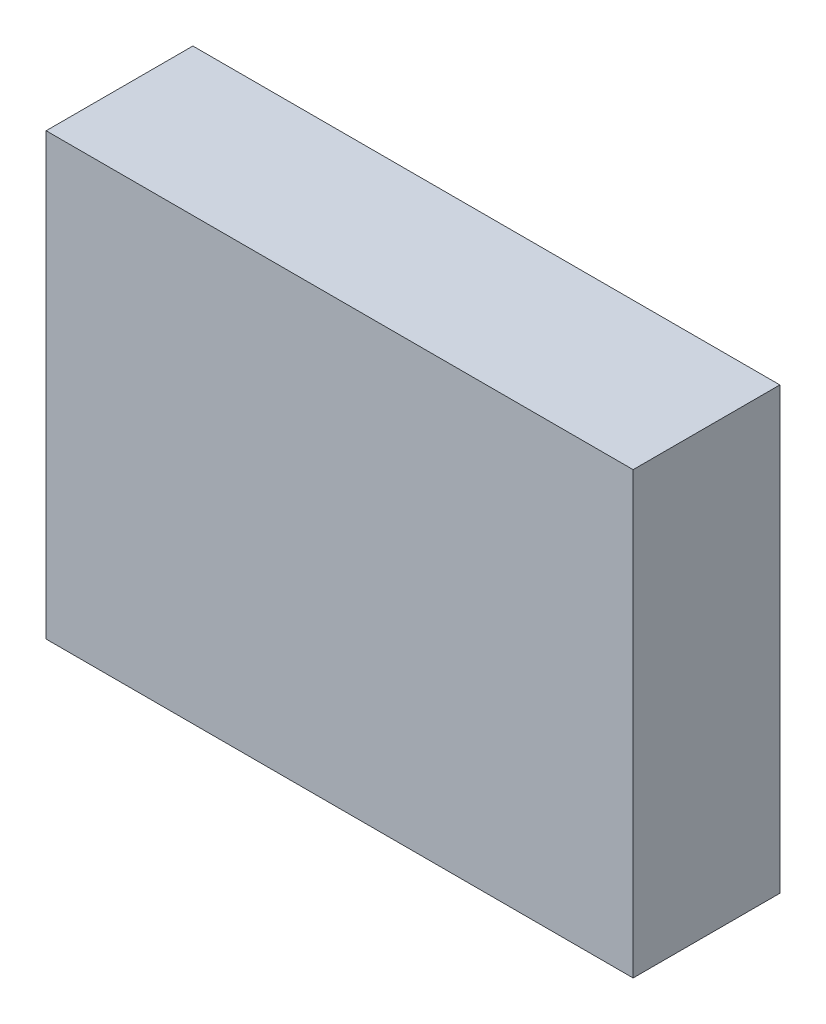
ISO-10303-21;
HEADER;
FILE_DESCRIPTION(('STEP AP214'),'2;1');
FILE_NAME('part.step','',(''),(''),'','','');
FILE_SCHEMA(('AUTOMOTIVE_DESIGN { 1 0 10303 214 1 1 1 1 }'));
ENDSEC;
DATA;
#1=APPLICATION_CONTEXT('core data for automotive mechanical design processes');
#2=APPLICATION_PROTOCOL_DEFINITION('international standard','automotive_design',2000,#1);
#3=PRODUCT_CONTEXT('',#1,'mechanical');
#4=PRODUCT('Part','Part','',(#3));
#5=PRODUCT_RELATED_PRODUCT_CATEGORY('part','',(#4));
#6=PRODUCT_DEFINITION_FORMATION('','',#4);
#7=PRODUCT_DEFINITION_CONTEXT('part definition',#1,'design');
#8=PRODUCT_DEFINITION('design','',#6,#7);
#9=PRODUCT_DEFINITION_SHAPE('','',#8);
#10=(LENGTH_UNIT() NAMED_UNIT(*) SI_UNIT(.MILLI.,.METRE.));
#11=(NAMED_UNIT(*) PLANE_ANGLE_UNIT() SI_UNIT($,.RADIAN.));
#12=(NAMED_UNIT(*) SI_UNIT($,.STERADIAN.) SOLID_ANGLE_UNIT());
#13=UNCERTAINTY_MEASURE_WITH_UNIT(LENGTH_MEASURE(1.E-05),#10,'distance_accuracy_value','');
#14=(GEOMETRIC_REPRESENTATION_CONTEXT(3) GLOBAL_UNCERTAINTY_ASSIGNED_CONTEXT((#13)) GLOBAL_UNIT_ASSIGNED_CONTEXT((#10,
#11,#12)) REPRESENTATION_CONTEXT('',''));
#15=CARTESIAN_POINT('',(0.,0.,0.));
#16=DIRECTION('',(0.,0.,1.));
#17=DIRECTION('',(1.,0.,0.));
#18=AXIS2_PLACEMENT_3D('',#15,#16,#17);
#19=CARTESIAN_POINT('',(0.,0.,3.));
#20=DIRECTION('',(0.,0.,-1.));
#21=DIRECTION('',(-1.,0.,0.));
#22=AXIS2_PLACEMENT_3D('',#19,#20,#21);
#23=CYLINDRICAL_SURFACE('',#22,37.5);
#24=CARTESIAN_POINT('',(0.,0.,3.));
#25=DIRECTION('',(0.,0.,1.));
#26=DIRECTION('',(1.,0.,0.));
#27=AXIS2_PLACEMENT_3D('',#24,#25,#26);
#28=CIRCLE('',#27,37.5);
#29=CARTESIAN_POINT('',(37.5,0.,3.));
#30=VERTEX_POINT('',#29);
#31=EDGE_CURVE('E46',#30,#30,#28,.T.);
#32=ORIENTED_EDGE('',*,*,#31,.F.);
#33=EDGE_LOOP('',(#32));
#34=FACE_BOUND('',#33,.T.);
#35=CARTESIAN_POINT('',(0.,0.,0.));
#36=DIRECTION('',(0.,0.,1.));
#37=DIRECTION('',(1.,0.,0.));
#38=AXIS2_PLACEMENT_3D('',#35,#36,#37);
#39=CIRCLE('',#38,37.5);
#40=CARTESIAN_POINT('',(37.5,0.,0.));
#41=VERTEX_POINT('',#40);
#42=EDGE_CURVE('E148',#41,#41,#39,.T.);
#43=ORIENTED_EDGE('',*,*,#42,.T.);
#44=EDGE_LOOP('',(#43));
#45=FACE_BOUND('',#44,.T.);
#46=ADVANCED_FACE('F38',(#34,#45),#23,.T.);
#47=CARTESIAN_POINT('',(0.,0.,0.));
#48=DIRECTION('',(0.,0.,1.));
#49=DIRECTION('',(1.,0.,0.));
#50=AXIS2_PLACEMENT_3D('',#47,#48,#49);
#51=PLANE('',#50);
#52=CARTESIAN_POINT('',(-30.,1.04744440165294E-13,0.));
#53=DIRECTION('',(0.,0.,1.));
#54=DIRECTION('',(1.,0.,0.));
#55=AXIS2_PLACEMENT_3D('',#52,#53,#54);
#56=CIRCLE('',#55,1.5);
#57=CARTESIAN_POINT('',(-28.5,1.04744440165294E-13,0.));
#58=VERTEX_POINT('',#57);
#59=EDGE_CURVE('E156',#58,#58,#56,.T.);
#60=ORIENTED_EDGE('',*,*,#59,.T.);
#61=EDGE_LOOP('',(#60));
#62=FACE_BOUND('',#61,.T.);
#63=CARTESIAN_POINT('',(-21.2132034355963,21.2132034355965,0.));
#64=DIRECTION('',(0.,0.,1.));
#65=DIRECTION('',(1.,0.,0.));
#66=AXIS2_PLACEMENT_3D('',#63,#64,#65);
#67=CIRCLE('',#66,1.5);
#68=CARTESIAN_POINT('',(-19.7132034355963,21.2132034355965,0.));
#69=VERTEX_POINT('',#68);
#70=EDGE_CURVE('E171',#69,#69,#67,.T.);
#71=ORIENTED_EDGE('',*,*,#70,.T.);
#72=EDGE_LOOP('',(#71));
#73=FACE_BOUND('',#72,.T.);
#74=CARTESIAN_POINT('',(0.,30.,0.));
#75=DIRECTION('',(0.,0.,1.));
#76=DIRECTION('',(1.,0.,0.));
#77=AXIS2_PLACEMENT_3D('',#74,#75,#76);
#78=CIRCLE('',#77,1.5);
#79=CARTESIAN_POINT('',(1.5,30.,0.));
#80=VERTEX_POINT('',#79);
#81=EDGE_CURVE('E168',#80,#80,#78,.T.);
#82=ORIENTED_EDGE('',*,*,#81,.T.);
#83=EDGE_LOOP('',(#82));
#84=FACE_BOUND('',#83,.T.);
#85=CARTESIAN_POINT('',(21.2132034355966,21.2132034355962,0.));
#86=DIRECTION('',(0.,0.,1.));
#87=DIRECTION('',(1.,0.,0.));
#88=AXIS2_PLACEMENT_3D('',#85,#86,#87);
#89=CIRCLE('',#88,1.5);
#90=CARTESIAN_POINT('',(22.7132034355966,21.2132034355962,0.));
#91=VERTEX_POINT('',#90);
#92=EDGE_CURVE('E165',#91,#91,#89,.T.);
#93=ORIENTED_EDGE('',*,*,#92,.T.);
#94=EDGE_LOOP('',(#93));
#95=FACE_BOUND('',#94,.T.);
#96=CARTESIAN_POINT('',(30.,-3.14233320495882E-13,0.));
#97=DIRECTION('',(0.,0.,1.));
#98=DIRECTION('',(1.,0.,0.));
#99=AXIS2_PLACEMENT_3D('',#96,#97,#98);
#100=CIRCLE('',#99,1.5);
#101=CARTESIAN_POINT('',(31.5,-3.14233320495882E-13,0.));
#102=VERTEX_POINT('',#101);
#103=EDGE_CURVE('E162',#102,#102,#100,.T.);
#104=ORIENTED_EDGE('',*,*,#103,.T.);
#105=EDGE_LOOP('',(#104));
#106=FACE_BOUND('',#105,.T.);
#107=CARTESIAN_POINT('',(21.2132034355962,-21.2132034355967,0.));
#108=DIRECTION('',(0.,0.,1.));
#109=DIRECTION('',(1.,0.,0.));
#110=AXIS2_PLACEMENT_3D('',#107,#108,#109);
#111=CIRCLE('',#110,1.5);
#112=CARTESIAN_POINT('',(22.7132034355962,-21.2132034355967,0.));
#113=VERTEX_POINT('',#112);
#114=EDGE_CURVE('E159',#113,#113,#111,.T.);
#115=ORIENTED_EDGE('',*,*,#114,.T.);
#116=EDGE_LOOP('',(#115));
#117=FACE_BOUND('',#116,.T.);
#118=CARTESIAN_POINT('',(-21.2132034355965,-21.2132034355964,0.));
#119=DIRECTION('',(0.,0.,1.));
#120=DIRECTION('',(1.,0.,0.));
#121=AXIS2_PLACEMENT_3D('',#118,#119,#120);
#122=CIRCLE('',#121,1.5);
#123=CARTESIAN_POINT('',(-19.7132034355965,-21.2132034355964,0.));
#124=VERTEX_POINT('',#123);
#125=EDGE_CURVE('E144',#124,#124,#122,.T.);
#126=ORIENTED_EDGE('',*,*,#125,.T.);
#127=EDGE_LOOP('',(#126));
#128=FACE_BOUND('',#127,.T.);
#129=CARTESIAN_POINT('',(0.,-30.,0.));
#130=DIRECTION('',(0.,0.,1.));
#131=DIRECTION('',(1.,0.,0.));
#132=AXIS2_PLACEMENT_3D('',#129,#130,#131);
#133=CIRCLE('',#132,1.5);
#134=CARTESIAN_POINT('',(1.5,-30.,0.));
#135=VERTEX_POINT('',#134);
#136=EDGE_CURVE('E149',#135,#135,#133,.T.);
#137=ORIENTED_EDGE('',*,*,#136,.T.);
#138=EDGE_LOOP('',(#137));
#139=FACE_BOUND('',#138,.T.);
#140=CARTESIAN_POINT('',(0.,0.,0.));
#141=DIRECTION('',(0.,0.,-1.));
#142=DIRECTION('',(-1.,0.,0.));
#143=AXIS2_PLACEMENT_3D('',#140,#141,#142);
#144=CIRCLE('',#143,25.);
#145=CARTESIAN_POINT('',(-25.,0.,0.));
#146=VERTEX_POINT('',#145);
#147=EDGE_CURVE('E145',#146,#146,#144,.T.);
#148=ORIENTED_EDGE('',*,*,#147,.F.);
#149=EDGE_LOOP('',(#148));
#150=FACE_BOUND('',#149,.T.);
#151=ORIENTED_EDGE('',*,*,#42,.F.);
#152=EDGE_LOOP('',(#151));
#153=FACE_BOUND('',#152,.T.);
#154=ADVANCED_FACE('F176',(#62,#73,#84,#95,#106,#117,#128,#139,#150,#153),#51,.F.);
#155=CARTESIAN_POINT('',(0.,-30.,-10.));
#156=DIRECTION('',(0.,0.,1.));
#157=DIRECTION('',(1.,0.,0.));
#158=AXIS2_PLACEMENT_3D('',#155,#156,#157);
#159=CYLINDRICAL_SURFACE('',#158,1.5);
#160=CARTESIAN_POINT('',(0.,-30.,3.));
#161=DIRECTION('',(0.,0.,-1.));
#162=DIRECTION('',(-1.,0.,0.));
#163=AXIS2_PLACEMENT_3D('',#160,#161,#162);
#164=CIRCLE('',#163,1.5);
#165=CARTESIAN_POINT('',(-1.5,-30.,3.));
#166=VERTEX_POINT('',#165);
#167=EDGE_CURVE('E135',#166,#166,#164,.F.);
#168=ORIENTED_EDGE('',*,*,#167,.T.);
#169=EDGE_LOOP('',(#168));
#170=FACE_BOUND('',#169,.T.);
#171=ORIENTED_EDGE('',*,*,#136,.F.);
#172=EDGE_LOOP('',(#171));
#173=FACE_BOUND('',#172,.T.);
#174=ADVANCED_FACE('F201',(#170,#173),#159,.F.);
#175=CARTESIAN_POINT('',(-21.2132034355965,-21.2132034355964,-10.));
#176=DIRECTION('',(0.,0.,1.));
#177=DIRECTION('',(1.,0.,0.));
#178=AXIS2_PLACEMENT_3D('',#175,#176,#177);
#179=CYLINDRICAL_SURFACE('',#178,1.5);
#180=CARTESIAN_POINT('',(-21.2132034355965,-21.2132034355964,3.));
#181=DIRECTION('',(0.,0.,-1.));
#182=DIRECTION('',(-1.,0.,0.));
#183=AXIS2_PLACEMENT_3D('',#180,#181,#182);
#184=CIRCLE('',#183,1.5);
#185=CARTESIAN_POINT('',(-22.7132034355965,-21.2132034355964,3.));
#186=VERTEX_POINT('',#185);
#187=EDGE_CURVE('E132',#186,#186,#184,.F.);
#188=ORIENTED_EDGE('',*,*,#187,.T.);
#189=EDGE_LOOP('',(#188));
#190=FACE_BOUND('',#189,.T.);
#191=ORIENTED_EDGE('',*,*,#125,.F.);
#192=EDGE_LOOP('',(#191));
#193=FACE_BOUND('',#192,.T.);
#194=ADVANCED_FACE('F244',(#190,#193),#179,.F.);
#195=CARTESIAN_POINT('',(21.2132034355962,-21.2132034355967,-10.));
#196=DIRECTION('',(0.,0.,1.));
#197=DIRECTION('',(1.,0.,0.));
#198=AXIS2_PLACEMENT_3D('',#195,#196,#197);
#199=CYLINDRICAL_SURFACE('',#198,1.5);
#200=CARTESIAN_POINT('',(21.2132034355962,-21.2132034355967,3.));
#201=DIRECTION('',(0.,0.,-1.));
#202=DIRECTION('',(-1.,0.,0.));
#203=AXIS2_PLACEMENT_3D('',#200,#201,#202);
#204=CIRCLE('',#203,1.5);
#205=CARTESIAN_POINT('',(19.7132034355962,-21.2132034355967,3.));
#206=VERTEX_POINT('',#205);
#207=EDGE_CURVE('E129',#206,#206,#204,.F.);
#208=ORIENTED_EDGE('',*,*,#207,.T.);
#209=EDGE_LOOP('',(#208));
#210=FACE_BOUND('',#209,.T.);
#211=ORIENTED_EDGE('',*,*,#114,.F.);
#212=EDGE_LOOP('',(#211));
#213=FACE_BOUND('',#212,.T.);
#214=ADVANCED_FACE('F241',(#210,#213),#199,.F.);
#215=CARTESIAN_POINT('',(30.,-3.14233320495882E-13,-10.));
#216=DIRECTION('',(0.,0.,1.));
#217=DIRECTION('',(1.,0.,0.));
#218=AXIS2_PLACEMENT_3D('',#215,#216,#217);
#219=CYLINDRICAL_SURFACE('',#218,1.5);
#220=CARTESIAN_POINT('',(30.,-3.14233320495882E-13,3.));
#221=DIRECTION('',(0.,0.,-1.));
#222=DIRECTION('',(-1.,0.,0.));
#223=AXIS2_PLACEMENT_3D('',#220,#221,#222);
#224=CIRCLE('',#223,1.5);
#225=CARTESIAN_POINT('',(28.5,-3.14233320495882E-13,3.));
#226=VERTEX_POINT('',#225);
#227=EDGE_CURVE('E126',#226,#226,#224,.F.);
#228=ORIENTED_EDGE('',*,*,#227,.T.);
#229=EDGE_LOOP('',(#228));
#230=FACE_BOUND('',#229,.T.);
#231=ORIENTED_EDGE('',*,*,#103,.F.);
#232=EDGE_LOOP('',(#231));
#233=FACE_BOUND('',#232,.T.);
#234=ADVANCED_FACE('F238',(#230,#233),#219,.F.);
#235=CARTESIAN_POINT('',(21.2132034355966,21.2132034355962,-10.));
#236=DIRECTION('',(0.,0.,1.));
#237=DIRECTION('',(1.,0.,0.));
#238=AXIS2_PLACEMENT_3D('',#235,#236,#237);
#239=CYLINDRICAL_SURFACE('',#238,1.5);
#240=CARTESIAN_POINT('',(21.2132034355966,21.2132034355962,3.));
#241=DIRECTION('',(0.,0.,-1.));
#242=DIRECTION('',(-1.,0.,0.));
#243=AXIS2_PLACEMENT_3D('',#240,#241,#242);
#244=CIRCLE('',#243,1.5);
#245=CARTESIAN_POINT('',(19.7132034355966,21.2132034355962,3.));
#246=VERTEX_POINT('',#245);
#247=EDGE_CURVE('E123',#246,#246,#244,.F.);
#248=ORIENTED_EDGE('',*,*,#247,.T.);
#249=EDGE_LOOP('',(#248));
#250=FACE_BOUND('',#249,.T.);
#251=ORIENTED_EDGE('',*,*,#92,.F.);
#252=EDGE_LOOP('',(#251));
#253=FACE_BOUND('',#252,.T.);
#254=ADVANCED_FACE('F240',(#250,#253),#239,.F.);
#255=CARTESIAN_POINT('',(0.,30.,-10.));
#256=DIRECTION('',(0.,0.,1.));
#257=DIRECTION('',(1.,0.,0.));
#258=AXIS2_PLACEMENT_3D('',#255,#256,#257);
#259=CYLINDRICAL_SURFACE('',#258,1.5);
#260=CARTESIAN_POINT('',(0.,30.,3.));
#261=DIRECTION('',(0.,0.,-1.));
#262=DIRECTION('',(-1.,0.,0.));
#263=AXIS2_PLACEMENT_3D('',#260,#261,#262);
#264=CIRCLE('',#263,1.5);
#265=CARTESIAN_POINT('',(-1.5,30.,3.));
#266=VERTEX_POINT('',#265);
#267=EDGE_CURVE('E120',#266,#266,#264,.F.);
#268=ORIENTED_EDGE('',*,*,#267,.T.);
#269=EDGE_LOOP('',(#268));
#270=FACE_BOUND('',#269,.T.);
#271=ORIENTED_EDGE('',*,*,#81,.F.);
#272=EDGE_LOOP('',(#271));
#273=FACE_BOUND('',#272,.T.);
#274=ADVANCED_FACE('F192',(#270,#273),#259,.F.);
#275=CARTESIAN_POINT('',(-21.2132034355963,21.2132034355965,-10.));
#276=DIRECTION('',(0.,0.,1.));
#277=DIRECTION('',(1.,0.,0.));
#278=AXIS2_PLACEMENT_3D('',#275,#276,#277);
#279=CYLINDRICAL_SURFACE('',#278,1.5);
#280=CARTESIAN_POINT('',(-21.2132034355963,21.2132034355965,3.));
#281=DIRECTION('',(0.,0.,-1.));
#282=DIRECTION('',(-1.,0.,0.));
#283=AXIS2_PLACEMENT_3D('',#280,#281,#282);
#284=CIRCLE('',#283,1.5);
#285=CARTESIAN_POINT('',(-22.7132034355963,21.2132034355965,3.));
#286=VERTEX_POINT('',#285);
#287=EDGE_CURVE('E117',#286,#286,#284,.F.);
#288=ORIENTED_EDGE('',*,*,#287,.T.);
#289=EDGE_LOOP('',(#288));
#290=FACE_BOUND('',#289,.T.);
#291=ORIENTED_EDGE('',*,*,#70,.F.);
#292=EDGE_LOOP('',(#291));
#293=FACE_BOUND('',#292,.T.);
#294=ADVANCED_FACE('F182',(#290,#293),#279,.F.);
#295=CARTESIAN_POINT('',(-30.,1.04744440165294E-13,-10.));
#296=DIRECTION('',(0.,0.,1.));
#297=DIRECTION('',(1.,0.,0.));
#298=AXIS2_PLACEMENT_3D('',#295,#296,#297);
#299=CYLINDRICAL_SURFACE('',#298,1.5);
#300=CARTESIAN_POINT('',(-30.,1.04744440165294E-13,3.));
#301=DIRECTION('',(0.,0.,-1.));
#302=DIRECTION('',(-1.,0.,0.));
#303=AXIS2_PLACEMENT_3D('',#300,#301,#302);
#304=CIRCLE('',#303,1.5);
#305=CARTESIAN_POINT('',(-31.5,1.04744440165294E-13,3.));
#306=VERTEX_POINT('',#305);
#307=EDGE_CURVE('E114',#306,#306,#304,.F.);
#308=ORIENTED_EDGE('',*,*,#307,.T.);
#309=EDGE_LOOP('',(#308));
#310=FACE_BOUND('',#309,.T.);
#311=ORIENTED_EDGE('',*,*,#59,.F.);
#312=EDGE_LOOP('',(#311));
#313=FACE_BOUND('',#312,.T.);
#314=ADVANCED_FACE('F179',(#310,#313),#299,.F.);
#315=CARTESIAN_POINT('',(0.,0.,8.));
#316=DIRECTION('',(0.,0.,-1.));
#317=DIRECTION('',(-1.,0.,0.));
#318=AXIS2_PLACEMENT_3D('',#315,#316,#317);
#319=CYLINDRICAL_SURFACE('',#318,25.);
#320=CARTESIAN_POINT('',(0.,0.,-7.));
#321=DIRECTION('',(0.,0.,1.));
#322=DIRECTION('',(1.,0.,0.));
#323=AXIS2_PLACEMENT_3D('',#320,#321,#322);
#324=CIRCLE('',#323,25.);
#325=CARTESIAN_POINT('',(25.,0.,-7.));
#326=VERTEX_POINT('',#325);
#327=EDGE_CURVE('E141',#326,#326,#324,.T.);
#328=ORIENTED_EDGE('',*,*,#327,.T.);
#329=EDGE_LOOP('',(#328));
#330=FACE_BOUND('',#329,.T.);
#331=ORIENTED_EDGE('',*,*,#147,.T.);
#332=EDGE_LOOP('',(#331));
#333=FACE_BOUND('',#332,.T.);
#334=ADVANCED_FACE('F181',(#330,#333),#319,.T.);
#335=CARTESIAN_POINT('',(0.,0.,8.));
#336=DIRECTION('',(0.,0.,-1.));
#337=DIRECTION('',(-1.,0.,0.));
#338=AXIS2_PLACEMENT_3D('',#335,#336,#337);
#339=CYLINDRICAL_SURFACE('',#338,20.);
#340=CARTESIAN_POINT('',(0.,0.,3.));
#341=DIRECTION('',(0.,0.,-1.));
#342=DIRECTION('',(-1.,0.,0.));
#343=AXIS2_PLACEMENT_3D('',#340,#341,#342);
#344=CIRCLE('',#343,20.);
#345=CARTESIAN_POINT('',(-20.,0.,3.));
#346=VERTEX_POINT('',#345);
#347=EDGE_CURVE('E11',#346,#346,#344,.T.);
#348=ORIENTED_EDGE('',*,*,#347,.F.);
#349=EDGE_LOOP('',(#348));
#350=FACE_BOUND('',#349,.T.);
#351=CARTESIAN_POINT('',(0.,0.,-7.));
#352=DIRECTION('',(0.,0.,1.));
#353=DIRECTION('',(1.,0.,0.));
#354=AXIS2_PLACEMENT_3D('',#351,#352,#353);
#355=CIRCLE('',#354,20.);
#356=CARTESIAN_POINT('',(20.,0.,-7.));
#357=VERTEX_POINT('',#356);
#358=EDGE_CURVE('E138',#357,#357,#355,.T.);
#359=ORIENTED_EDGE('',*,*,#358,.F.);
#360=EDGE_LOOP('',(#359));
#361=FACE_BOUND('',#360,.T.);
#362=ADVANCED_FACE('F189',(#350,#361),#339,.F.);
#363=CARTESIAN_POINT('',(0.,0.,-7.));
#364=DIRECTION('',(0.,0.,1.));
#365=DIRECTION('',(1.,0.,0.));
#366=AXIS2_PLACEMENT_3D('',#363,#364,#365);
#367=PLANE('',#366);
#368=ORIENTED_EDGE('',*,*,#358,.T.);
#369=EDGE_LOOP('',(#368));
#370=FACE_BOUND('',#369,.T.);
#371=ORIENTED_EDGE('',*,*,#327,.F.);
#372=EDGE_LOOP('',(#371));
#373=FACE_BOUND('',#372,.T.);
#374=ADVANCED_FACE('F230',(#370,#373),#367,.F.);
#375=CARTESIAN_POINT('',(0.,0.,3.));
#376=DIRECTION('',(0.,0.,-1.));
#377=DIRECTION('',(-1.,0.,0.));
#378=AXIS2_PLACEMENT_3D('',#375,#376,#377);
#379=PLANE('',#378);
#380=ORIENTED_EDGE('',*,*,#347,.T.);
#381=EDGE_LOOP('',(#380));
#382=FACE_BOUND('',#381,.T.);
#383=ADVANCED_FACE('F233',(#382),#379,.T.);
#384=ORIENTED_EDGE('',*,*,#307,.F.);
#385=EDGE_LOOP('',(#384));
#386=FACE_BOUND('',#385,.T.);
#387=ADVANCED_FACE('F213',(#386),#379,.T.);
#388=ORIENTED_EDGE('',*,*,#287,.F.);
#389=EDGE_LOOP('',(#388));
#390=FACE_BOUND('',#389,.T.);
#391=ADVANCED_FACE('F290',(#390),#379,.T.);
#392=ORIENTED_EDGE('',*,*,#267,.F.);
#393=EDGE_LOOP('',(#392));
#394=FACE_BOUND('',#393,.T.);
#395=ADVANCED_FACE('F287',(#394),#379,.T.);
#396=ORIENTED_EDGE('',*,*,#247,.F.);
#397=EDGE_LOOP('',(#396));
#398=FACE_BOUND('',#397,.T.);
#399=ADVANCED_FACE('F289',(#398),#379,.T.);
#400=ORIENTED_EDGE('',*,*,#227,.F.);
#401=EDGE_LOOP('',(#400));
#402=FACE_BOUND('',#401,.T.);
#403=ADVANCED_FACE('F295',(#402),#379,.T.);
#404=ORIENTED_EDGE('',*,*,#207,.F.);
#405=EDGE_LOOP('',(#404));
#406=FACE_BOUND('',#405,.T.);
#407=ADVANCED_FACE('F346',(#406),#379,.T.);
#408=ORIENTED_EDGE('',*,*,#187,.F.);
#409=EDGE_LOOP('',(#408));
#410=FACE_BOUND('',#409,.T.);
#411=ADVANCED_FACE('F356',(#410),#379,.T.);
#412=ORIENTED_EDGE('',*,*,#167,.F.);
#413=EDGE_LOOP('',(#412));
#414=FACE_BOUND('',#413,.T.);
#415=ADVANCED_FACE('F211',(#414),#379,.T.);
#416=ORIENTED_EDGE('',*,*,#31,.T.);
#417=EDGE_LOOP('',(#416));
#418=FACE_BOUND('',#417,.T.);
#419=DIRECTION('',(0.,-1.,0.));
#420=VECTOR('',#419,1.);
#421=CARTESIAN_POINT('',(-100.,75.,3.));
#422=LINE('',#421,#420);
#423=CARTESIAN_POINT('',(-100.,75.,3.));
#424=VERTEX_POINT('',#423);
#425=CARTESIAN_POINT('',(-100.,-75.,3.));
#426=VERTEX_POINT('',#425);
#427=EDGE_CURVE('E105',#424,#426,#422,.T.);
#428=ORIENTED_EDGE('',*,*,#427,.F.);
#429=DIRECTION('',(-1.,0.,0.));
#430=VECTOR('',#429,1.);
#431=CARTESIAN_POINT('',(100.,75.,3.));
#432=LINE('',#431,#430);
#433=CARTESIAN_POINT('',(100.,75.,3.));
#434=VERTEX_POINT('',#433);
#435=EDGE_CURVE('E77',#434,#424,#432,.T.);
#436=ORIENTED_EDGE('',*,*,#435,.F.);
#437=DIRECTION('',(0.,1.,0.));
#438=VECTOR('',#437,1.);
#439=CARTESIAN_POINT('',(100.,75.,3.));
#440=LINE('',#439,#438);
#441=CARTESIAN_POINT('',(100.,-75.,3.));
#442=VERTEX_POINT('',#441);
#443=EDGE_CURVE('E71',#442,#434,#440,.T.);
#444=ORIENTED_EDGE('',*,*,#443,.F.);
#445=DIRECTION('',(1.,0.,0.));
#446=VECTOR('',#445,1.);
#447=CARTESIAN_POINT('',(100.,-75.,3.));
#448=LINE('',#447,#446);
#449=EDGE_CURVE('E95',#426,#442,#448,.T.);
#450=ORIENTED_EDGE('',*,*,#449,.F.);
#451=EDGE_LOOP('',(#428,#436,#444,#450));
#452=FACE_BOUND('',#451,.T.);
#453=ADVANCED_FACE('F207',(#418,#452),#379,.T.);
#454=CARTESIAN_POINT('',(-100.,75.,53.));
#455=DIRECTION('',(1.,0.,0.));
#456=DIRECTION('',(0.,1.,0.));
#457=AXIS2_PLACEMENT_3D('',#454,#455,#456);
#458=PLANE('',#457);
#459=ORIENTED_EDGE('',*,*,#427,.T.);
#460=DIRECTION('',(0.,0.,-1.));
#461=VECTOR('',#460,1.);
#462=CARTESIAN_POINT('',(-100.,-75.,53.));
#463=LINE('',#462,#461);
#464=CARTESIAN_POINT('',(-100.,-75.,53.));
#465=VERTEX_POINT('',#464);
#466=EDGE_CURVE('E96',#465,#426,#463,.T.);
#467=ORIENTED_EDGE('',*,*,#466,.F.);
#468=DIRECTION('',(0.,-1.,0.));
#469=VECTOR('',#468,1.);
#470=CARTESIAN_POINT('',(-100.,75.,53.));
#471=LINE('',#470,#469);
#472=CARTESIAN_POINT('',(-100.,75.,53.));
#473=VERTEX_POINT('',#472);
#474=EDGE_CURVE('E90',#473,#465,#471,.T.);
#475=ORIENTED_EDGE('',*,*,#474,.F.);
#476=DIRECTION('',(0.,0.,-1.));
#477=VECTOR('',#476,1.);
#478=CARTESIAN_POINT('',(-100.,75.,53.));
#479=LINE('',#478,#477);
#480=EDGE_CURVE('E101',#473,#424,#479,.T.);
#481=ORIENTED_EDGE('',*,*,#480,.T.);
#482=EDGE_LOOP('',(#459,#467,#475,#481));
#483=FACE_BOUND('',#482,.T.);
#484=ADVANCED_FACE('F210',(#483),#458,.F.);
#485=CARTESIAN_POINT('',(100.,-75.,53.));
#486=DIRECTION('',(0.,1.,0.));
#487=DIRECTION('',(-1.,0.,0.));
#488=AXIS2_PLACEMENT_3D('',#485,#486,#487);
#489=PLANE('',#488);
#490=ORIENTED_EDGE('',*,*,#449,.T.);
#491=DIRECTION('',(0.,0.,-1.));
#492=VECTOR('',#491,1.);
#493=CARTESIAN_POINT('',(100.,-75.,53.));
#494=LINE('',#493,#492);
#495=CARTESIAN_POINT('',(100.,-75.,53.));
#496=VERTEX_POINT('',#495);
#497=EDGE_CURVE('E93',#496,#442,#494,.T.);
#498=ORIENTED_EDGE('',*,*,#497,.F.);
#499=DIRECTION('',(1.,0.,0.));
#500=VECTOR('',#499,1.);
#501=CARTESIAN_POINT('',(100.,-75.,53.));
#502=LINE('',#501,#500);
#503=EDGE_CURVE('E85',#465,#496,#502,.T.);
#504=ORIENTED_EDGE('',*,*,#503,.F.);
#505=ORIENTED_EDGE('',*,*,#466,.T.);
#506=EDGE_LOOP('',(#490,#498,#504,#505));
#507=FACE_BOUND('',#506,.T.);
#508=ADVANCED_FACE('F94',(#507),#489,.F.);
#509=CARTESIAN_POINT('',(100.,75.,53.));
#510=DIRECTION('',(-1.,0.,0.));
#511=DIRECTION('',(0.,-1.,0.));
#512=AXIS2_PLACEMENT_3D('',#509,#510,#511);
#513=PLANE('',#512);
#514=ORIENTED_EDGE('',*,*,#443,.T.);
#515=DIRECTION('',(0.,0.,-1.));
#516=VECTOR('',#515,1.);
#517=CARTESIAN_POINT('',(100.,75.,53.));
#518=LINE('',#517,#516);
#519=CARTESIAN_POINT('',(100.,75.,53.));
#520=VERTEX_POINT('',#519);
#521=EDGE_CURVE('E97',#520,#434,#518,.T.);
#522=ORIENTED_EDGE('',*,*,#521,.F.);
#523=DIRECTION('',(0.,1.,0.));
#524=VECTOR('',#523,1.);
#525=CARTESIAN_POINT('',(100.,75.,53.));
#526=LINE('',#525,#524);
#527=EDGE_CURVE('E88',#496,#520,#526,.T.);
#528=ORIENTED_EDGE('',*,*,#527,.F.);
#529=ORIENTED_EDGE('',*,*,#497,.T.);
#530=EDGE_LOOP('',(#514,#522,#528,#529));
#531=FACE_BOUND('',#530,.T.);
#532=ADVANCED_FACE('F99',(#531),#513,.F.);
#533=CARTESIAN_POINT('',(100.,75.,53.));
#534=DIRECTION('',(0.,-1.,0.));
#535=DIRECTION('',(1.,0.,0.));
#536=AXIS2_PLACEMENT_3D('',#533,#534,#535);
#537=PLANE('',#536);
#538=ORIENTED_EDGE('',*,*,#435,.T.);
#539=ORIENTED_EDGE('',*,*,#480,.F.);
#540=DIRECTION('',(-1.,0.,0.));
#541=VECTOR('',#540,1.);
#542=CARTESIAN_POINT('',(100.,75.,53.));
#543=LINE('',#542,#541);
#544=EDGE_CURVE('E54',#520,#473,#543,.T.);
#545=ORIENTED_EDGE('',*,*,#544,.F.);
#546=ORIENTED_EDGE('',*,*,#521,.T.);
#547=EDGE_LOOP('',(#538,#539,#545,#546));
#548=FACE_BOUND('',#547,.T.);
#549=ADVANCED_FACE('F216',(#548),#537,.F.);
#550=CARTESIAN_POINT('',(0.,0.,53.));
#551=DIRECTION('',(0.,0.,-1.));
#552=DIRECTION('',(-1.,0.,0.));
#553=AXIS2_PLACEMENT_3D('',#550,#551,#552);
#554=PLANE('',#553);
#555=ORIENTED_EDGE('',*,*,#474,.T.);
#556=ORIENTED_EDGE('',*,*,#503,.T.);
#557=ORIENTED_EDGE('',*,*,#527,.T.);
#558=ORIENTED_EDGE('',*,*,#544,.T.);
#559=EDGE_LOOP('',(#555,#556,#557,#558));
#560=FACE_BOUND('',#559,.T.);
#561=ADVANCED_FACE('F86',(#560),#554,.F.);
#562=CLOSED_SHELL('',(#46,#154,#174,#194,#214,#234,#254,#274,#294,#314,#334,#362,#374,#383,#387,
#391,#395,#399,#403,#407,#411,#415,#453,#484,#508,#532,#549,#561));
#563=MANIFOLD_SOLID_BREP('B2',#562);
#564=ADVANCED_BREP_SHAPE_REPRESENTATION('',(#18,#563),#14);
#565=SHAPE_DEFINITION_REPRESENTATION(#9,#564);
ENDSEC;
END-ISO-10303-21;
